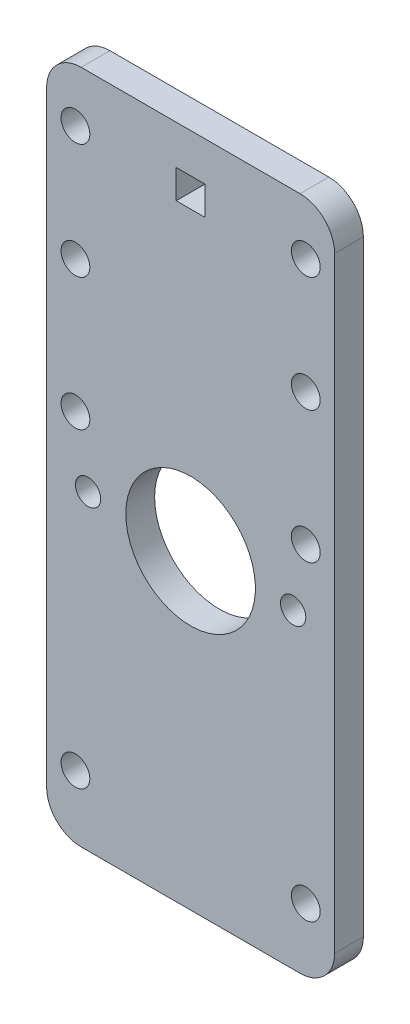
ISO-10303-21;
HEADER;
FILE_DESCRIPTION(('STEP AP214'),'2;1');
FILE_NAME('part.step','',(''),(''),'','','');
FILE_SCHEMA(('AUTOMOTIVE_DESIGN { 1 0 10303 214 1 1 1 1 }'));
ENDSEC;
DATA;
#1=APPLICATION_CONTEXT('core data for automotive mechanical design processes');
#2=APPLICATION_PROTOCOL_DEFINITION('international standard','automotive_design',2000,#1);
#3=PRODUCT_CONTEXT('',#1,'mechanical');
#4=PRODUCT('Part','Part','',(#3));
#5=PRODUCT_RELATED_PRODUCT_CATEGORY('part','',(#4));
#6=PRODUCT_DEFINITION_FORMATION('','',#4);
#7=PRODUCT_DEFINITION_CONTEXT('part definition',#1,'design');
#8=PRODUCT_DEFINITION('design','',#6,#7);
#9=PRODUCT_DEFINITION_SHAPE('','',#8);
#10=(LENGTH_UNIT() NAMED_UNIT(*) SI_UNIT(.MILLI.,.METRE.));
#11=(NAMED_UNIT(*) PLANE_ANGLE_UNIT() SI_UNIT($,.RADIAN.));
#12=(NAMED_UNIT(*) SI_UNIT($,.STERADIAN.) SOLID_ANGLE_UNIT());
#13=UNCERTAINTY_MEASURE_WITH_UNIT(LENGTH_MEASURE(1.E-05),#10,'distance_accuracy_value','');
#14=(GEOMETRIC_REPRESENTATION_CONTEXT(3) GLOBAL_UNCERTAINTY_ASSIGNED_CONTEXT((#13)) GLOBAL_UNIT_ASSIGNED_CONTEXT((#10,
#11,#12)) REPRESENTATION_CONTEXT('',''));
#15=CARTESIAN_POINT('',(0.,0.,0.));
#16=DIRECTION('',(0.,0.,1.));
#17=DIRECTION('',(1.,0.,0.));
#18=AXIS2_PLACEMENT_3D('',#15,#16,#17);
#19=CARTESIAN_POINT('',(-18.1,-22.0973062704397,-6.35));
#20=DIRECTION('',(0.,0.,-1.));
#21=DIRECTION('',(-1.,0.,0.));
#22=AXIS2_PLACEMENT_3D('',#19,#20,#21);
#23=PLANE('',#22);
#24=CARTESIAN_POINT('',(22.61,17.8847845003735,-6.35));
#25=DIRECTION('',(0.,0.,1.));
#26=DIRECTION('',(1.,0.,0.));
#27=AXIS2_PLACEMENT_3D('',#24,#25,#26);
#28=CIRCLE('',#27,2.794);
#29=CARTESIAN_POINT('',(25.404,17.8847845003735,-6.35));
#30=VERTEX_POINT('',#29);
#31=EDGE_CURVE('E597',#30,#30,#28,.T.);
#32=ORIENTED_EDGE('',*,*,#31,.T.);
#33=EDGE_LOOP('',(#32));
#34=FACE_BOUND('',#33,.T.);
#35=CARTESIAN_POINT('',(-22.61,17.8847845003735,-6.35));
#36=DIRECTION('',(0.,0.,1.));
#37=DIRECTION('',(1.,0.,0.));
#38=AXIS2_PLACEMENT_3D('',#35,#36,#37);
#39=CIRCLE('',#38,2.794);
#40=CARTESIAN_POINT('',(-19.816,17.8847845003735,-6.35));
#41=VERTEX_POINT('',#40);
#42=EDGE_CURVE('E591',#41,#41,#39,.T.);
#43=ORIENTED_EDGE('',*,*,#42,.T.);
#44=EDGE_LOOP('',(#43));
#45=FACE_BOUND('',#44,.T.);
#46=CARTESIAN_POINT('',(0.,17.8847845003735,-6.35));
#47=DIRECTION('',(0.,0.,-1.));
#48=DIRECTION('',(-1.,0.,0.));
#49=AXIS2_PLACEMENT_3D('',#46,#47,#48);
#50=CIRCLE('',#49,14.2875);
#51=CARTESIAN_POINT('',(-14.2875,17.8847845003735,-6.35));
#52=VERTEX_POINT('',#51);
#53=EDGE_CURVE('E172',#52,#52,#50,.T.);
#54=ORIENTED_EDGE('',*,*,#53,.F.);
#55=EDGE_LOOP('',(#54));
#56=FACE_BOUND('',#55,.T.);
#57=CARTESIAN_POINT('',(25.4,31.8547845003731,-6.35));
#58=DIRECTION('',(0.,0.,-1.));
#59=DIRECTION('',(-1.,0.,0.));
#60=AXIS2_PLACEMENT_3D('',#57,#58,#59);
#61=CIRCLE('',#60,3.175);
#62=CARTESIAN_POINT('',(22.225,31.8547845003731,-6.35));
#63=VERTEX_POINT('',#62);
#64=EDGE_CURVE('E185',#63,#63,#61,.T.);
#65=ORIENTED_EDGE('',*,*,#64,.F.);
#66=EDGE_LOOP('',(#65));
#67=FACE_BOUND('',#66,.T.);
#68=CARTESIAN_POINT('',(25.3999999999993,-36.7252154996269,-6.35));
#69=DIRECTION('',(0.,0.,-1.));
#70=DIRECTION('',(-1.,0.,0.));
#71=AXIS2_PLACEMENT_3D('',#68,#69,#70);
#72=CIRCLE('',#71,3.175);
#73=CARTESIAN_POINT('',(22.2249999999993,-36.7252154996269,-6.35));
#74=VERTEX_POINT('',#73);
#75=EDGE_CURVE('E191',#74,#74,#72,.T.);
#76=ORIENTED_EDGE('',*,*,#75,.F.);
#77=EDGE_LOOP('',(#76));
#78=FACE_BOUND('',#77,.T.);
#79=CARTESIAN_POINT('',(-25.4000000000007,-36.7252154996265,-6.35));
#80=DIRECTION('',(0.,0.,-1.));
#81=DIRECTION('',(-1.,0.,0.));
#82=AXIS2_PLACEMENT_3D('',#79,#80,#81);
#83=CIRCLE('',#82,3.175);
#84=CARTESIAN_POINT('',(-28.5750000000007,-36.7252154996265,-6.35));
#85=VERTEX_POINT('',#84);
#86=EDGE_CURVE('E178',#85,#85,#83,.T.);
#87=ORIENTED_EDGE('',*,*,#86,.F.);
#88=EDGE_LOOP('',(#87));
#89=FACE_BOUND('',#88,.T.);
#90=CARTESIAN_POINT('',(-25.4,31.8547845003735,-6.35));
#91=DIRECTION('',(0.,0.,-1.));
#92=DIRECTION('',(-1.,0.,0.));
#93=AXIS2_PLACEMENT_3D('',#90,#91,#92);
#94=CIRCLE('',#93,3.175);
#95=CARTESIAN_POINT('',(-28.575,31.8547845003735,-6.35));
#96=VERTEX_POINT('',#95);
#97=EDGE_CURVE('E184',#96,#96,#94,.T.);
#98=ORIENTED_EDGE('',*,*,#97,.F.);
#99=EDGE_LOOP('',(#98));
#100=FACE_BOUND('',#99,.T.);
#101=DIRECTION('',(-1.,0.,0.));
#102=VECTOR('',#101,1.);
#103=CARTESIAN_POINT('',(31.75,-50.6952154996265,-6.35));
#104=LINE('',#103,#102);
#105=CARTESIAN_POINT('',(24.13,-50.6952154996265,-6.35));
#106=VERTEX_POINT('',#105);
#107=CARTESIAN_POINT('',(-24.13,-50.6952154996265,-6.35));
#108=VERTEX_POINT('',#107);
#109=EDGE_CURVE('E209',#106,#108,#104,.T.);
#110=ORIENTED_EDGE('',*,*,#109,.T.);
#111=CARTESIAN_POINT('',(-24.13,-43.0752154996265,-6.35));
#112=DIRECTION('',(0.,0.,-1.));
#113=DIRECTION('',(-1.,0.,0.));
#114=AXIS2_PLACEMENT_3D('',#111,#112,#113);
#115=CIRCLE('',#114,7.62);
#116=CARTESIAN_POINT('',(-31.75,-43.0752154996265,-6.35));
#117=VERTEX_POINT('',#116);
#118=EDGE_CURVE('E233',#108,#117,#115,.T.);
#119=ORIENTED_EDGE('',*,*,#118,.T.);
#120=DIRECTION('',(0.,1.,0.));
#121=VECTOR('',#120,1.);
#122=CARTESIAN_POINT('',(-31.75,38.2047845003735,-6.35));
#123=LINE('',#122,#121);
#124=CARTESIAN_POINT('',(-31.75,90.5847845003735,-6.35));
#125=VERTEX_POINT('',#124);
#126=EDGE_CURVE('E202',#117,#125,#123,.T.);
#127=ORIENTED_EDGE('',*,*,#126,.T.);
#128=CARTESIAN_POINT('',(-24.13,90.5847845003735,-6.35));
#129=DIRECTION('',(0.,0.,-1.));
#130=DIRECTION('',(-1.,0.,0.));
#131=AXIS2_PLACEMENT_3D('',#128,#129,#130);
#132=CIRCLE('',#131,7.62);
#133=CARTESIAN_POINT('',(-24.13,98.2047845003734,-6.35));
#134=VERTEX_POINT('',#133);
#135=EDGE_CURVE('E229',#125,#134,#132,.T.);
#136=ORIENTED_EDGE('',*,*,#135,.T.);
#137=DIRECTION('',(1.,0.,0.));
#138=VECTOR('',#137,1.);
#139=CARTESIAN_POINT('',(31.75,98.2047845003734,-6.35));
#140=LINE('',#139,#138);
#141=CARTESIAN_POINT('',(24.13,98.2047845003734,-6.35));
#142=VERTEX_POINT('',#141);
#143=EDGE_CURVE('E166',#134,#142,#140,.T.);
#144=ORIENTED_EDGE('',*,*,#143,.T.);
#145=CARTESIAN_POINT('',(24.13,90.5847845003735,-6.35));
#146=DIRECTION('',(0.,0.,-1.));
#147=DIRECTION('',(-1.,0.,0.));
#148=AXIS2_PLACEMENT_3D('',#145,#146,#147);
#149=CIRCLE('',#148,7.62);
#150=CARTESIAN_POINT('',(31.75,90.5847845003735,-6.35));
#151=VERTEX_POINT('',#150);
#152=EDGE_CURVE('E227',#142,#151,#149,.T.);
#153=ORIENTED_EDGE('',*,*,#152,.T.);
#154=DIRECTION('',(0.,-1.,0.));
#155=VECTOR('',#154,1.);
#156=CARTESIAN_POINT('',(31.75,38.2047845003735,-6.35));
#157=LINE('',#156,#155);
#158=CARTESIAN_POINT('',(31.75,-43.0752154996265,-6.35));
#159=VERTEX_POINT('',#158);
#160=EDGE_CURVE('E218',#151,#159,#157,.T.);
#161=ORIENTED_EDGE('',*,*,#160,.T.);
#162=CARTESIAN_POINT('',(24.13,-43.0752154996265,-6.35));
#163=DIRECTION('',(0.,0.,-1.));
#164=DIRECTION('',(-1.,0.,0.));
#165=AXIS2_PLACEMENT_3D('',#162,#163,#164);
#166=CIRCLE('',#165,7.62);
#167=EDGE_CURVE('E231',#159,#106,#166,.T.);
#168=ORIENTED_EDGE('',*,*,#167,.T.);
#169=EDGE_LOOP('',(#110,#119,#127,#136,#144,#153,#161,#168));
#170=FACE_BOUND('',#169,.T.);
#171=CARTESIAN_POINT('',(-25.4,86.3797845003735,-6.35));
#172=DIRECTION('',(0.,0.,-1.));
#173=DIRECTION('',(1.,0.,0.));
#174=AXIS2_PLACEMENT_3D('',#171,#172,#173);
#175=CIRCLE('',#174,3.175);
#176=CARTESIAN_POINT('',(-22.225,86.3797845003735,-6.35));
#177=VERTEX_POINT('',#176);
#178=EDGE_CURVE('E588',#177,#177,#175,.T.);
#179=ORIENTED_EDGE('',*,*,#178,.F.);
#180=EDGE_LOOP('',(#179));
#181=FACE_BOUND('',#180,.T.);
#182=CARTESIAN_POINT('',(25.3999999999997,60.9797845003735,-6.35));
#183=DIRECTION('',(0.,0.,-1.));
#184=DIRECTION('',(-1.,0.,0.));
#185=AXIS2_PLACEMENT_3D('',#182,#183,#184);
#186=CIRCLE('',#185,3.175);
#187=CARTESIAN_POINT('',(22.2249999999997,60.9797845003735,-6.35));
#188=VERTEX_POINT('',#187);
#189=EDGE_CURVE('E582',#188,#188,#186,.T.);
#190=ORIENTED_EDGE('',*,*,#189,.F.);
#191=EDGE_LOOP('',(#190));
#192=FACE_BOUND('',#191,.T.);
#193=CARTESIAN_POINT('',(-25.3999999999997,60.9797845003735,-6.35));
#194=DIRECTION('',(0.,0.,-1.));
#195=DIRECTION('',(1.,0.,0.));
#196=AXIS2_PLACEMENT_3D('',#193,#194,#195);
#197=CIRCLE('',#196,3.175);
#198=CARTESIAN_POINT('',(-22.2249999999997,60.9797845003735,-6.35));
#199=VERTEX_POINT('',#198);
#200=EDGE_CURVE('E574',#199,#199,#197,.T.);
#201=ORIENTED_EDGE('',*,*,#200,.F.);
#202=EDGE_LOOP('',(#201));
#203=FACE_BOUND('',#202,.T.);
#204=CARTESIAN_POINT('',(25.4,86.3797845003735,-6.35));
#205=DIRECTION('',(0.,0.,-1.));
#206=DIRECTION('',(-1.,0.,0.));
#207=AXIS2_PLACEMENT_3D('',#204,#205,#206);
#208=CIRCLE('',#207,3.175);
#209=CARTESIAN_POINT('',(22.225,86.3797845003735,-6.35));
#210=VERTEX_POINT('',#209);
#211=EDGE_CURVE('E153',#210,#210,#208,.T.);
#212=ORIENTED_EDGE('',*,*,#211,.F.);
#213=EDGE_LOOP('',(#212));
#214=FACE_BOUND('',#213,.T.);
#215=DIRECTION('',(1.,0.,0.));
#216=VECTOR('',#215,1.);
#217=CARTESIAN_POINT('',(3.175,89.5547845003735,-6.35));
#218=LINE('',#217,#216);
#219=CARTESIAN_POINT('',(-3.175,89.5547845003735,-6.35));
#220=VERTEX_POINT('',#219);
#221=CARTESIAN_POINT('',(3.175,89.5547845003735,-6.35));
#222=VERTEX_POINT('',#221);
#223=EDGE_CURVE('E159',#220,#222,#218,.T.);
#224=ORIENTED_EDGE('',*,*,#223,.F.);
#225=DIRECTION('',(0.,1.,0.));
#226=VECTOR('',#225,1.);
#227=CARTESIAN_POINT('',(-3.175,89.5547845003735,-6.35));
#228=LINE('',#227,#226);
#229=CARTESIAN_POINT('',(-3.175,83.2047845003735,-6.35));
#230=VERTEX_POINT('',#229);
#231=EDGE_CURVE('E130',#230,#220,#228,.T.);
#232=ORIENTED_EDGE('',*,*,#231,.F.);
#233=DIRECTION('',(-1.,0.,0.));
#234=VECTOR('',#233,1.);
#235=CARTESIAN_POINT('',(3.175,83.2047845003735,-6.35));
#236=LINE('',#235,#234);
#237=CARTESIAN_POINT('',(3.175,83.2047845003735,-6.35));
#238=VERTEX_POINT('',#237);
#239=EDGE_CURVE('E147',#238,#230,#236,.T.);
#240=ORIENTED_EDGE('',*,*,#239,.F.);
#241=DIRECTION('',(0.,-1.,0.));
#242=VECTOR('',#241,1.);
#243=CARTESIAN_POINT('',(3.175,89.5547845003735,-6.35));
#244=LINE('',#243,#242);
#245=EDGE_CURVE('E150',#222,#238,#244,.T.);
#246=ORIENTED_EDGE('',*,*,#245,.F.);
#247=EDGE_LOOP('',(#224,#232,#240,#246));
#248=FACE_BOUND('',#247,.T.);
#249=ADVANCED_FACE('F34',(#34,#45,#56,#67,#78,#89,#100,#170,#181,#192,#203,#214,#248),#23,.T.);
#250=CARTESIAN_POINT('',(-18.1,-22.0973062704397,0.));
#251=DIRECTION('',(0.,0.,-1.));
#252=DIRECTION('',(-1.,0.,0.));
#253=AXIS2_PLACEMENT_3D('',#250,#251,#252);
#254=PLANE('',#253);
#255=CARTESIAN_POINT('',(22.61,17.8847845003735,0.));
#256=DIRECTION('',(0.,0.,1.));
#257=DIRECTION('',(1.,0.,0.));
#258=AXIS2_PLACEMENT_3D('',#255,#256,#257);
#259=CIRCLE('',#258,2.794);
#260=CARTESIAN_POINT('',(25.404,17.8847845003735,0.));
#261=VERTEX_POINT('',#260);
#262=EDGE_CURVE('E600',#261,#261,#259,.T.);
#263=ORIENTED_EDGE('',*,*,#262,.F.);
#264=EDGE_LOOP('',(#263));
#265=FACE_BOUND('',#264,.T.);
#266=CARTESIAN_POINT('',(-22.61,17.8847845003735,0.));
#267=DIRECTION('',(0.,0.,1.));
#268=DIRECTION('',(1.,0.,0.));
#269=AXIS2_PLACEMENT_3D('',#266,#267,#268);
#270=CIRCLE('',#269,2.794);
#271=CARTESIAN_POINT('',(-19.816,17.8847845003735,0.));
#272=VERTEX_POINT('',#271);
#273=EDGE_CURVE('E594',#272,#272,#270,.T.);
#274=ORIENTED_EDGE('',*,*,#273,.F.);
#275=EDGE_LOOP('',(#274));
#276=FACE_BOUND('',#275,.T.);
#277=CARTESIAN_POINT('',(0.,17.8847845003735,0.));
#278=DIRECTION('',(0.,0.,-1.));
#279=DIRECTION('',(-1.,0.,0.));
#280=AXIS2_PLACEMENT_3D('',#277,#278,#279);
#281=CIRCLE('',#280,14.2875);
#282=CARTESIAN_POINT('',(-14.2875,17.8847845003735,0.));
#283=VERTEX_POINT('',#282);
#284=EDGE_CURVE('E175',#283,#283,#281,.T.);
#285=ORIENTED_EDGE('',*,*,#284,.T.);
#286=EDGE_LOOP('',(#285));
#287=FACE_BOUND('',#286,.T.);
#288=CARTESIAN_POINT('',(25.4,31.8547845003731,0.));
#289=DIRECTION('',(0.,0.,-1.));
#290=DIRECTION('',(-1.,0.,0.));
#291=AXIS2_PLACEMENT_3D('',#288,#289,#290);
#292=CIRCLE('',#291,3.175);
#293=CARTESIAN_POINT('',(22.225,31.8547845003731,0.));
#294=VERTEX_POINT('',#293);
#295=EDGE_CURVE('E181',#294,#294,#292,.T.);
#296=ORIENTED_EDGE('',*,*,#295,.T.);
#297=EDGE_LOOP('',(#296));
#298=FACE_BOUND('',#297,.T.);
#299=CARTESIAN_POINT('',(25.3999999999993,-36.7252154996269,0.));
#300=DIRECTION('',(0.,0.,-1.));
#301=DIRECTION('',(-1.,0.,0.));
#302=AXIS2_PLACEMENT_3D('',#299,#300,#301);
#303=CIRCLE('',#302,3.175);
#304=CARTESIAN_POINT('',(22.2249999999993,-36.7252154996269,0.));
#305=VERTEX_POINT('',#304);
#306=EDGE_CURVE('E188',#305,#305,#303,.T.);
#307=ORIENTED_EDGE('',*,*,#306,.T.);
#308=EDGE_LOOP('',(#307));
#309=FACE_BOUND('',#308,.T.);
#310=CARTESIAN_POINT('',(-25.4000000000007,-36.7252154996265,0.));
#311=DIRECTION('',(0.,0.,-1.));
#312=DIRECTION('',(-1.,0.,0.));
#313=AXIS2_PLACEMENT_3D('',#310,#311,#312);
#314=CIRCLE('',#313,3.175);
#315=CARTESIAN_POINT('',(-28.5750000000007,-36.7252154996265,0.));
#316=VERTEX_POINT('',#315);
#317=EDGE_CURVE('E194',#316,#316,#314,.T.);
#318=ORIENTED_EDGE('',*,*,#317,.T.);
#319=EDGE_LOOP('',(#318));
#320=FACE_BOUND('',#319,.T.);
#321=CARTESIAN_POINT('',(-25.4,31.8547845003735,0.));
#322=DIRECTION('',(0.,0.,-1.));
#323=DIRECTION('',(-1.,0.,0.));
#324=AXIS2_PLACEMENT_3D('',#321,#322,#323);
#325=CIRCLE('',#324,3.175);
#326=CARTESIAN_POINT('',(-28.575,31.8547845003735,0.));
#327=VERTEX_POINT('',#326);
#328=EDGE_CURVE('E199',#327,#327,#325,.T.);
#329=ORIENTED_EDGE('',*,*,#328,.T.);
#330=EDGE_LOOP('',(#329));
#331=FACE_BOUND('',#330,.T.);
#332=DIRECTION('',(0.,1.,0.));
#333=VECTOR('',#332,1.);
#334=CARTESIAN_POINT('',(-31.75,38.2047845003735,0.));
#335=LINE('',#334,#333);
#336=CARTESIAN_POINT('',(-31.75,-43.0752154996265,0.));
#337=VERTEX_POINT('',#336);
#338=CARTESIAN_POINT('',(-31.75,90.5847845003735,0.));
#339=VERTEX_POINT('',#338);
#340=EDGE_CURVE('E205',#337,#339,#335,.T.);
#341=ORIENTED_EDGE('',*,*,#340,.F.);
#342=CARTESIAN_POINT('',(-24.13,-43.0752154996265,0.));
#343=DIRECTION('',(0.,0.,-1.));
#344=DIRECTION('',(-1.,0.,0.));
#345=AXIS2_PLACEMENT_3D('',#342,#343,#344);
#346=CIRCLE('',#345,7.62);
#347=CARTESIAN_POINT('',(-24.13,-50.6952154996265,0.));
#348=VERTEX_POINT('',#347);
#349=EDGE_CURVE('E245',#337,#348,#346,.F.);
#350=ORIENTED_EDGE('',*,*,#349,.T.);
#351=DIRECTION('',(-1.,0.,0.));
#352=VECTOR('',#351,1.);
#353=CARTESIAN_POINT('',(31.75,-50.6952154996265,0.));
#354=LINE('',#353,#352);
#355=CARTESIAN_POINT('',(24.13,-50.6952154996265,0.));
#356=VERTEX_POINT('',#355);
#357=EDGE_CURVE('E212',#356,#348,#354,.T.);
#358=ORIENTED_EDGE('',*,*,#357,.F.);
#359=CARTESIAN_POINT('',(24.13,-43.0752154996265,0.));
#360=DIRECTION('',(0.,0.,-1.));
#361=DIRECTION('',(-1.,0.,0.));
#362=AXIS2_PLACEMENT_3D('',#359,#360,#361);
#363=CIRCLE('',#362,7.62);
#364=CARTESIAN_POINT('',(31.75,-43.0752154996265,0.));
#365=VERTEX_POINT('',#364);
#366=EDGE_CURVE('E243',#356,#365,#363,.F.);
#367=ORIENTED_EDGE('',*,*,#366,.T.);
#368=DIRECTION('',(0.,-1.,0.));
#369=VECTOR('',#368,1.);
#370=CARTESIAN_POINT('',(31.75,38.2047845003735,0.));
#371=LINE('',#370,#369);
#372=CARTESIAN_POINT('',(31.75,90.5847845003735,0.));
#373=VERTEX_POINT('',#372);
#374=EDGE_CURVE('E208',#373,#365,#371,.T.);
#375=ORIENTED_EDGE('',*,*,#374,.F.);
#376=CARTESIAN_POINT('',(24.13,90.5847845003735,0.));
#377=DIRECTION('',(0.,0.,-1.));
#378=DIRECTION('',(-1.,0.,0.));
#379=AXIS2_PLACEMENT_3D('',#376,#377,#378);
#380=CIRCLE('',#379,7.62);
#381=CARTESIAN_POINT('',(24.13,98.2047845003734,0.));
#382=VERTEX_POINT('',#381);
#383=EDGE_CURVE('E49',#373,#382,#380,.F.);
#384=ORIENTED_EDGE('',*,*,#383,.T.);
#385=DIRECTION('',(1.,0.,0.));
#386=VECTOR('',#385,1.);
#387=CARTESIAN_POINT('',(31.75,98.2047845003734,0.));
#388=LINE('',#387,#386);
#389=CARTESIAN_POINT('',(-24.13,98.2047845003734,0.));
#390=VERTEX_POINT('',#389);
#391=EDGE_CURVE('E170',#390,#382,#388,.T.);
#392=ORIENTED_EDGE('',*,*,#391,.F.);
#393=CARTESIAN_POINT('',(-24.13,90.5847845003735,0.));
#394=DIRECTION('',(0.,0.,-1.));
#395=DIRECTION('',(-1.,0.,0.));
#396=AXIS2_PLACEMENT_3D('',#393,#394,#395);
#397=CIRCLE('',#396,7.62);
#398=EDGE_CURVE('E241',#390,#339,#397,.F.);
#399=ORIENTED_EDGE('',*,*,#398,.T.);
#400=EDGE_LOOP('',(#341,#350,#358,#367,#375,#384,#392,#399));
#401=FACE_BOUND('',#400,.T.);
#402=CARTESIAN_POINT('',(-25.4,86.3797845003735,0.));
#403=DIRECTION('',(0.,0.,-1.));
#404=DIRECTION('',(1.,0.,0.));
#405=AXIS2_PLACEMENT_3D('',#402,#403,#404);
#406=CIRCLE('',#405,3.175);
#407=CARTESIAN_POINT('',(-22.225,86.3797845003735,0.));
#408=VERTEX_POINT('',#407);
#409=EDGE_CURVE('E585',#408,#408,#406,.T.);
#410=ORIENTED_EDGE('',*,*,#409,.T.);
#411=EDGE_LOOP('',(#410));
#412=FACE_BOUND('',#411,.T.);
#413=CARTESIAN_POINT('',(25.3999999999997,60.9797845003735,0.));
#414=DIRECTION('',(0.,0.,-1.));
#415=DIRECTION('',(-1.,0.,0.));
#416=AXIS2_PLACEMENT_3D('',#413,#414,#415);
#417=CIRCLE('',#416,3.175);
#418=CARTESIAN_POINT('',(22.2249999999997,60.9797845003735,0.));
#419=VERTEX_POINT('',#418);
#420=EDGE_CURVE('E579',#419,#419,#417,.T.);
#421=ORIENTED_EDGE('',*,*,#420,.T.);
#422=EDGE_LOOP('',(#421));
#423=FACE_BOUND('',#422,.T.);
#424=CARTESIAN_POINT('',(-25.3999999999997,60.9797845003735,0.));
#425=DIRECTION('',(0.,0.,-1.));
#426=DIRECTION('',(1.,0.,0.));
#427=AXIS2_PLACEMENT_3D('',#424,#425,#426);
#428=CIRCLE('',#427,3.175);
#429=CARTESIAN_POINT('',(-22.2249999999997,60.9797845003735,0.));
#430=VERTEX_POINT('',#429);
#431=EDGE_CURVE('E572',#430,#430,#428,.T.);
#432=ORIENTED_EDGE('',*,*,#431,.T.);
#433=EDGE_LOOP('',(#432));
#434=FACE_BOUND('',#433,.T.);
#435=CARTESIAN_POINT('',(25.4,86.3797845003735,0.));
#436=DIRECTION('',(0.,0.,-1.));
#437=DIRECTION('',(-1.,0.,0.));
#438=AXIS2_PLACEMENT_3D('',#435,#436,#437);
#439=CIRCLE('',#438,3.175);
#440=CARTESIAN_POINT('',(22.225,86.3797845003735,0.));
#441=VERTEX_POINT('',#440);
#442=EDGE_CURVE('E160',#441,#441,#439,.T.);
#443=ORIENTED_EDGE('',*,*,#442,.T.);
#444=EDGE_LOOP('',(#443));
#445=FACE_BOUND('',#444,.T.);
#446=DIRECTION('',(0.,1.,0.));
#447=VECTOR('',#446,1.);
#448=CARTESIAN_POINT('',(-3.175,89.5547845003735,0.));
#449=LINE('',#448,#447);
#450=CARTESIAN_POINT('',(-3.175,83.2047845003735,0.));
#451=VERTEX_POINT('',#450);
#452=CARTESIAN_POINT('',(-3.175,89.5547845003735,0.));
#453=VERTEX_POINT('',#452);
#454=EDGE_CURVE('E127',#451,#453,#449,.T.);
#455=ORIENTED_EDGE('',*,*,#454,.T.);
#456=DIRECTION('',(1.,0.,0.));
#457=VECTOR('',#456,1.);
#458=CARTESIAN_POINT('',(3.175,89.5547845003735,0.));
#459=LINE('',#458,#457);
#460=CARTESIAN_POINT('',(3.175,89.5547845003735,0.));
#461=VERTEX_POINT('',#460);
#462=EDGE_CURVE('E139',#453,#461,#459,.T.);
#463=ORIENTED_EDGE('',*,*,#462,.T.);
#464=DIRECTION('',(0.,-1.,0.));
#465=VECTOR('',#464,1.);
#466=CARTESIAN_POINT('',(3.175,89.5547845003735,0.));
#467=LINE('',#466,#465);
#468=CARTESIAN_POINT('',(3.175,83.2047845003735,0.));
#469=VERTEX_POINT('',#468);
#470=EDGE_CURVE('E143',#461,#469,#467,.T.);
#471=ORIENTED_EDGE('',*,*,#470,.T.);
#472=DIRECTION('',(-1.,0.,0.));
#473=VECTOR('',#472,1.);
#474=CARTESIAN_POINT('',(3.175,83.2047845003735,0.));
#475=LINE('',#474,#473);
#476=EDGE_CURVE('E135',#469,#451,#475,.T.);
#477=ORIENTED_EDGE('',*,*,#476,.T.);
#478=EDGE_LOOP('',(#455,#463,#471,#477));
#479=FACE_BOUND('',#478,.T.);
#480=ADVANCED_FACE('F145',(#265,#276,#287,#298,#309,#320,#331,#401,#412,#423,#434,#445,#479),
#254,.F.);
#481=CARTESIAN_POINT('',(-31.75,38.2047845003735,0.));
#482=DIRECTION('',(-1.,0.,0.));
#483=DIRECTION('',(0.,-1.,0.));
#484=AXIS2_PLACEMENT_3D('',#481,#482,#483);
#485=PLANE('',#484);
#486=ORIENTED_EDGE('',*,*,#126,.F.);
#487=DIRECTION('',(0.,0.,-1.));
#488=VECTOR('',#487,1.);
#489=CARTESIAN_POINT('',(-31.75,-43.0752154996265,0.));
#490=LINE('',#489,#488);
#491=EDGE_CURVE('E238',#117,#337,#490,.F.);
#492=ORIENTED_EDGE('',*,*,#491,.T.);
#493=ORIENTED_EDGE('',*,*,#340,.T.);
#494=DIRECTION('',(0.,0.,-1.));
#495=VECTOR('',#494,1.);
#496=CARTESIAN_POINT('',(-31.75,90.5847845003735,0.));
#497=LINE('',#496,#495);
#498=EDGE_CURVE('E235',#339,#125,#497,.T.);
#499=ORIENTED_EDGE('',*,*,#498,.T.);
#500=EDGE_LOOP('',(#486,#492,#493,#499));
#501=FACE_BOUND('',#500,.T.);
#502=ADVANCED_FACE('F264',(#501),#485,.T.);
#503=CARTESIAN_POINT('',(31.75,-50.6952154996265,0.));
#504=DIRECTION('',(0.,-1.,0.));
#505=DIRECTION('',(1.,0.,0.));
#506=AXIS2_PLACEMENT_3D('',#503,#504,#505);
#507=PLANE('',#506);
#508=ORIENTED_EDGE('',*,*,#357,.T.);
#509=DIRECTION('',(0.,0.,-1.));
#510=VECTOR('',#509,1.);
#511=CARTESIAN_POINT('',(-24.13,-50.6952154996265,0.));
#512=LINE('',#511,#510);
#513=EDGE_CURVE('E224',#348,#108,#512,.T.);
#514=ORIENTED_EDGE('',*,*,#513,.T.);
#515=ORIENTED_EDGE('',*,*,#109,.F.);
#516=DIRECTION('',(0.,0.,-1.));
#517=VECTOR('',#516,1.);
#518=CARTESIAN_POINT('',(24.13,-50.6952154996265,0.));
#519=LINE('',#518,#517);
#520=EDGE_CURVE('E215',#106,#356,#519,.F.);
#521=ORIENTED_EDGE('',*,*,#520,.T.);
#522=EDGE_LOOP('',(#508,#514,#515,#521));
#523=FACE_BOUND('',#522,.T.);
#524=ADVANCED_FACE('F275',(#523),#507,.T.);
#525=CARTESIAN_POINT('',(31.75,38.2047845003735,0.));
#526=DIRECTION('',(1.,0.,0.));
#527=DIRECTION('',(0.,1.,0.));
#528=AXIS2_PLACEMENT_3D('',#525,#526,#527);
#529=PLANE('',#528);
#530=ORIENTED_EDGE('',*,*,#374,.T.);
#531=DIRECTION('',(0.,0.,-1.));
#532=VECTOR('',#531,1.);
#533=CARTESIAN_POINT('',(31.75,-43.0752154996265,0.));
#534=LINE('',#533,#532);
#535=EDGE_CURVE('E249',#365,#159,#534,.T.);
#536=ORIENTED_EDGE('',*,*,#535,.T.);
#537=ORIENTED_EDGE('',*,*,#160,.F.);
#538=DIRECTION('',(0.,0.,-1.));
#539=VECTOR('',#538,1.);
#540=CARTESIAN_POINT('',(31.75,90.5847845003735,0.));
#541=LINE('',#540,#539);
#542=EDGE_CURVE('E247',#151,#373,#541,.F.);
#543=ORIENTED_EDGE('',*,*,#542,.T.);
#544=EDGE_LOOP('',(#530,#536,#537,#543));
#545=FACE_BOUND('',#544,.T.);
#546=ADVANCED_FACE('F282',(#545),#529,.T.);
#547=CARTESIAN_POINT('',(-25.4,31.8547845003735,0.));
#548=DIRECTION('',(0.,0.,-1.));
#549=DIRECTION('',(-1.,0.,0.));
#550=AXIS2_PLACEMENT_3D('',#547,#548,#549);
#551=CYLINDRICAL_SURFACE('',#550,3.175);
#552=ORIENTED_EDGE('',*,*,#328,.F.);
#553=EDGE_LOOP('',(#552));
#554=FACE_BOUND('',#553,.T.);
#555=ORIENTED_EDGE('',*,*,#97,.T.);
#556=EDGE_LOOP('',(#555));
#557=FACE_BOUND('',#556,.T.);
#558=ADVANCED_FACE('F403',(#554,#557),#551,.F.);
#559=CARTESIAN_POINT('',(-25.4000000000007,-36.7252154996265,0.));
#560=DIRECTION('',(0.,0.,-1.));
#561=DIRECTION('',(-1.,0.,0.));
#562=AXIS2_PLACEMENT_3D('',#559,#560,#561);
#563=CYLINDRICAL_SURFACE('',#562,3.175);
#564=ORIENTED_EDGE('',*,*,#317,.F.);
#565=EDGE_LOOP('',(#564));
#566=FACE_BOUND('',#565,.T.);
#567=ORIENTED_EDGE('',*,*,#86,.T.);
#568=EDGE_LOOP('',(#567));
#569=FACE_BOUND('',#568,.T.);
#570=ADVANCED_FACE('F399',(#566,#569),#563,.F.);
#571=CARTESIAN_POINT('',(25.3999999999993,-36.7252154996269,0.));
#572=DIRECTION('',(0.,0.,-1.));
#573=DIRECTION('',(-1.,0.,0.));
#574=AXIS2_PLACEMENT_3D('',#571,#572,#573);
#575=CYLINDRICAL_SURFACE('',#574,3.175);
#576=ORIENTED_EDGE('',*,*,#306,.F.);
#577=EDGE_LOOP('',(#576));
#578=FACE_BOUND('',#577,.T.);
#579=ORIENTED_EDGE('',*,*,#75,.T.);
#580=EDGE_LOOP('',(#579));
#581=FACE_BOUND('',#580,.T.);
#582=ADVANCED_FACE('F395',(#578,#581),#575,.F.);
#583=CARTESIAN_POINT('',(25.4,31.8547845003731,0.));
#584=DIRECTION('',(0.,0.,-1.));
#585=DIRECTION('',(-1.,0.,0.));
#586=AXIS2_PLACEMENT_3D('',#583,#584,#585);
#587=CYLINDRICAL_SURFACE('',#586,3.175);
#588=ORIENTED_EDGE('',*,*,#295,.F.);
#589=EDGE_LOOP('',(#588));
#590=FACE_BOUND('',#589,.T.);
#591=ORIENTED_EDGE('',*,*,#64,.T.);
#592=EDGE_LOOP('',(#591));
#593=FACE_BOUND('',#592,.T.);
#594=ADVANCED_FACE('F391',(#590,#593),#587,.F.);
#595=CARTESIAN_POINT('',(0.,17.8847845003735,0.));
#596=DIRECTION('',(0.,0.,-1.));
#597=DIRECTION('',(-1.,0.,0.));
#598=AXIS2_PLACEMENT_3D('',#595,#596,#597);
#599=CYLINDRICAL_SURFACE('',#598,14.2875);
#600=ORIENTED_EDGE('',*,*,#284,.F.);
#601=EDGE_LOOP('',(#600));
#602=FACE_BOUND('',#601,.T.);
#603=ORIENTED_EDGE('',*,*,#53,.T.);
#604=EDGE_LOOP('',(#603));
#605=FACE_BOUND('',#604,.T.);
#606=ADVANCED_FACE('F388',(#602,#605),#599,.F.);
#607=CARTESIAN_POINT('',(31.75,98.2047845003734,0.));
#608=DIRECTION('',(0.,1.,0.));
#609=DIRECTION('',(0.,0.,1.));
#610=AXIS2_PLACEMENT_3D('',#607,#608,#609);
#611=PLANE('',#610);
#612=ORIENTED_EDGE('',*,*,#143,.F.);
#613=DIRECTION('',(0.,0.,-1.));
#614=VECTOR('',#613,1.);
#615=CARTESIAN_POINT('',(-24.13,98.2047845003734,0.));
#616=LINE('',#615,#614);
#617=EDGE_CURVE('E11',#134,#390,#616,.F.);
#618=ORIENTED_EDGE('',*,*,#617,.T.);
#619=ORIENTED_EDGE('',*,*,#391,.T.);
#620=DIRECTION('',(0.,0.,-1.));
#621=VECTOR('',#620,1.);
#622=CARTESIAN_POINT('',(24.13,98.2047845003734,0.));
#623=LINE('',#622,#621);
#624=EDGE_CURVE('E42',#382,#142,#623,.T.);
#625=ORIENTED_EDGE('',*,*,#624,.T.);
#626=EDGE_LOOP('',(#612,#618,#619,#625));
#627=FACE_BOUND('',#626,.T.);
#628=ADVANCED_FACE('F253',(#627),#611,.T.);
#629=CARTESIAN_POINT('',(-3.175,89.5547845003735,0.));
#630=DIRECTION('',(-1.,0.,0.));
#631=DIRECTION('',(0.,-1.,0.));
#632=AXIS2_PLACEMENT_3D('',#629,#630,#631);
#633=PLANE('',#632);
#634=ORIENTED_EDGE('',*,*,#231,.T.);
#635=DIRECTION('',(0.,0.,-1.));
#636=VECTOR('',#635,1.);
#637=CARTESIAN_POINT('',(-3.175,89.5547845003735,0.));
#638=LINE('',#637,#636);
#639=EDGE_CURVE('E123',#453,#220,#638,.T.);
#640=ORIENTED_EDGE('',*,*,#639,.F.);
#641=ORIENTED_EDGE('',*,*,#454,.F.);
#642=DIRECTION('',(0.,0.,-1.));
#643=VECTOR('',#642,1.);
#644=CARTESIAN_POINT('',(-3.175,83.2047845003735,0.));
#645=LINE('',#644,#643);
#646=EDGE_CURVE('E164',#451,#230,#645,.T.);
#647=ORIENTED_EDGE('',*,*,#646,.T.);
#648=EDGE_LOOP('',(#634,#640,#641,#647));
#649=FACE_BOUND('',#648,.T.);
#650=ADVANCED_FACE('F125',(#649),#633,.F.);
#651=CARTESIAN_POINT('',(3.175,83.2047845003735,0.));
#652=DIRECTION('',(0.,-1.,0.));
#653=DIRECTION('',(0.,0.,-1.));
#654=AXIS2_PLACEMENT_3D('',#651,#652,#653);
#655=PLANE('',#654);
#656=ORIENTED_EDGE('',*,*,#239,.T.);
#657=ORIENTED_EDGE('',*,*,#646,.F.);
#658=ORIENTED_EDGE('',*,*,#476,.F.);
#659=DIRECTION('',(0.,0.,-1.));
#660=VECTOR('',#659,1.);
#661=CARTESIAN_POINT('',(3.175,83.2047845003735,0.));
#662=LINE('',#661,#660);
#663=EDGE_CURVE('E167',#469,#238,#662,.T.);
#664=ORIENTED_EDGE('',*,*,#663,.T.);
#665=EDGE_LOOP('',(#656,#657,#658,#664));
#666=FACE_BOUND('',#665,.T.);
#667=ADVANCED_FACE('F374',(#666),#655,.F.);
#668=CARTESIAN_POINT('',(3.175,89.5547845003735,0.));
#669=DIRECTION('',(1.,0.,0.));
#670=DIRECTION('',(0.,1.,0.));
#671=AXIS2_PLACEMENT_3D('',#668,#669,#670);
#672=PLANE('',#671);
#673=ORIENTED_EDGE('',*,*,#245,.T.);
#674=ORIENTED_EDGE('',*,*,#663,.F.);
#675=ORIENTED_EDGE('',*,*,#470,.F.);
#676=DIRECTION('',(0.,0.,-1.));
#677=VECTOR('',#676,1.);
#678=CARTESIAN_POINT('',(3.175,89.5547845003735,0.));
#679=LINE('',#678,#677);
#680=EDGE_CURVE('E134',#461,#222,#679,.T.);
#681=ORIENTED_EDGE('',*,*,#680,.T.);
#682=EDGE_LOOP('',(#673,#674,#675,#681));
#683=FACE_BOUND('',#682,.T.);
#684=ADVANCED_FACE('F377',(#683),#672,.F.);
#685=CARTESIAN_POINT('',(3.175,89.5547845003735,0.));
#686=DIRECTION('',(0.,1.,0.));
#687=DIRECTION('',(0.,0.,1.));
#688=AXIS2_PLACEMENT_3D('',#685,#686,#687);
#689=PLANE('',#688);
#690=ORIENTED_EDGE('',*,*,#223,.T.);
#691=ORIENTED_EDGE('',*,*,#680,.F.);
#692=ORIENTED_EDGE('',*,*,#462,.F.);
#693=ORIENTED_EDGE('',*,*,#639,.T.);
#694=EDGE_LOOP('',(#690,#691,#692,#693));
#695=FACE_BOUND('',#694,.T.);
#696=ADVANCED_FACE('F140',(#695),#689,.F.);
#697=CARTESIAN_POINT('',(25.4,86.3797845003735,0.));
#698=DIRECTION('',(0.,0.,-1.));
#699=DIRECTION('',(-1.,0.,0.));
#700=AXIS2_PLACEMENT_3D('',#697,#698,#699);
#701=CYLINDRICAL_SURFACE('',#700,3.175);
#702=ORIENTED_EDGE('',*,*,#442,.F.);
#703=EDGE_LOOP('',(#702));
#704=FACE_BOUND('',#703,.T.);
#705=ORIENTED_EDGE('',*,*,#211,.T.);
#706=EDGE_LOOP('',(#705));
#707=FACE_BOUND('',#706,.T.);
#708=ADVANCED_FACE('F369',(#704,#707),#701,.F.);
#709=CARTESIAN_POINT('',(-25.3999999999997,60.9797845003735,0.));
#710=DIRECTION('',(0.,0.,-1.));
#711=DIRECTION('',(-1.,0.,0.));
#712=AXIS2_PLACEMENT_3D('',#709,#710,#711);
#713=CYLINDRICAL_SURFACE('',#712,3.175);
#714=ORIENTED_EDGE('',*,*,#431,.F.);
#715=EDGE_LOOP('',(#714));
#716=FACE_BOUND('',#715,.T.);
#717=ORIENTED_EDGE('',*,*,#200,.T.);
#718=EDGE_LOOP('',(#717));
#719=FACE_BOUND('',#718,.T.);
#720=ADVANCED_FACE('F365',(#716,#719),#713,.F.);
#721=CARTESIAN_POINT('',(25.3999999999997,60.9797845003735,0.));
#722=DIRECTION('',(0.,0.,-1.));
#723=DIRECTION('',(-1.,0.,0.));
#724=AXIS2_PLACEMENT_3D('',#721,#722,#723);
#725=CYLINDRICAL_SURFACE('',#724,3.175);
#726=ORIENTED_EDGE('',*,*,#420,.F.);
#727=EDGE_LOOP('',(#726));
#728=FACE_BOUND('',#727,.T.);
#729=ORIENTED_EDGE('',*,*,#189,.T.);
#730=EDGE_LOOP('',(#729));
#731=FACE_BOUND('',#730,.T.);
#732=ADVANCED_FACE('F361',(#728,#731),#725,.F.);
#733=CARTESIAN_POINT('',(-25.4,86.3797845003735,0.));
#734=DIRECTION('',(0.,0.,-1.));
#735=DIRECTION('',(-1.,0.,0.));
#736=AXIS2_PLACEMENT_3D('',#733,#734,#735);
#737=CYLINDRICAL_SURFACE('',#736,3.175);
#738=ORIENTED_EDGE('',*,*,#409,.F.);
#739=EDGE_LOOP('',(#738));
#740=FACE_BOUND('',#739,.T.);
#741=ORIENTED_EDGE('',*,*,#178,.T.);
#742=EDGE_LOOP('',(#741));
#743=FACE_BOUND('',#742,.T.);
#744=ADVANCED_FACE('F308',(#740,#743),#737,.F.);
#745=CARTESIAN_POINT('',(-24.13,-43.0752154996265,0.));
#746=DIRECTION('',(0.,0.,-1.));
#747=DIRECTION('',(-1.,0.,0.));
#748=AXIS2_PLACEMENT_3D('',#745,#746,#747);
#749=CYLINDRICAL_SURFACE('',#748,7.62);
#750=ORIENTED_EDGE('',*,*,#349,.F.);
#751=ORIENTED_EDGE('',*,*,#491,.F.);
#752=ORIENTED_EDGE('',*,*,#118,.F.);
#753=ORIENTED_EDGE('',*,*,#513,.F.);
#754=EDGE_LOOP('',(#750,#751,#752,#753));
#755=FACE_BOUND('',#754,.T.);
#756=ADVANCED_FACE('F272',(#755),#749,.T.);
#757=CARTESIAN_POINT('',(24.13,-43.0752154996265,0.));
#758=DIRECTION('',(0.,0.,-1.));
#759=DIRECTION('',(-1.,0.,0.));
#760=AXIS2_PLACEMENT_3D('',#757,#758,#759);
#761=CYLINDRICAL_SURFACE('',#760,7.62);
#762=ORIENTED_EDGE('',*,*,#366,.F.);
#763=ORIENTED_EDGE('',*,*,#520,.F.);
#764=ORIENTED_EDGE('',*,*,#167,.F.);
#765=ORIENTED_EDGE('',*,*,#535,.F.);
#766=EDGE_LOOP('',(#762,#763,#764,#765));
#767=FACE_BOUND('',#766,.T.);
#768=ADVANCED_FACE('F280',(#767),#761,.T.);
#769=CARTESIAN_POINT('',(-24.13,90.5847845003735,0.));
#770=DIRECTION('',(0.,0.,-1.));
#771=DIRECTION('',(-1.,0.,0.));
#772=AXIS2_PLACEMENT_3D('',#769,#770,#771);
#773=CYLINDRICAL_SURFACE('',#772,7.62);
#774=ORIENTED_EDGE('',*,*,#398,.F.);
#775=ORIENTED_EDGE('',*,*,#617,.F.);
#776=ORIENTED_EDGE('',*,*,#135,.F.);
#777=ORIENTED_EDGE('',*,*,#498,.F.);
#778=EDGE_LOOP('',(#774,#775,#776,#777));
#779=FACE_BOUND('',#778,.T.);
#780=ADVANCED_FACE('F262',(#779),#773,.T.);
#781=CARTESIAN_POINT('',(24.13,90.5847845003735,0.));
#782=DIRECTION('',(0.,0.,-1.));
#783=DIRECTION('',(-1.,0.,0.));
#784=AXIS2_PLACEMENT_3D('',#781,#782,#783);
#785=CYLINDRICAL_SURFACE('',#784,7.62);
#786=ORIENTED_EDGE('',*,*,#383,.F.);
#787=ORIENTED_EDGE('',*,*,#542,.F.);
#788=ORIENTED_EDGE('',*,*,#152,.F.);
#789=ORIENTED_EDGE('',*,*,#624,.F.);
#790=EDGE_LOOP('',(#786,#787,#788,#789));
#791=FACE_BOUND('',#790,.T.);
#792=ADVANCED_FACE('F36',(#791),#785,.T.);
#793=CARTESIAN_POINT('',(-22.61,17.8847845003735,-6.35));
#794=DIRECTION('',(0.,0.,1.));
#795=DIRECTION('',(1.,0.,0.));
#796=AXIS2_PLACEMENT_3D('',#793,#794,#795);
#797=CYLINDRICAL_SURFACE('',#796,2.794);
#798=ORIENTED_EDGE('',*,*,#42,.F.);
#799=EDGE_LOOP('',(#798));
#800=FACE_BOUND('',#799,.T.);
#801=ORIENTED_EDGE('',*,*,#273,.T.);
#802=EDGE_LOOP('',(#801));
#803=FACE_BOUND('',#802,.T.);
#804=ADVANCED_FACE('F285',(#800,#803),#797,.F.);
#805=CARTESIAN_POINT('',(22.61,17.8847845003735,-6.35));
#806=DIRECTION('',(0.,0.,1.));
#807=DIRECTION('',(1.,0.,0.));
#808=AXIS2_PLACEMENT_3D('',#805,#806,#807);
#809=CYLINDRICAL_SURFACE('',#808,2.794);
#810=ORIENTED_EDGE('',*,*,#31,.F.);
#811=EDGE_LOOP('',(#810));
#812=FACE_BOUND('',#811,.T.);
#813=ORIENTED_EDGE('',*,*,#262,.T.);
#814=EDGE_LOOP('',(#813));
#815=FACE_BOUND('',#814,.T.);
#816=ADVANCED_FACE('F290',(#812,#815),#809,.F.);
#817=CLOSED_SHELL('',(#249,#480,#502,#524,#546,#558,#570,#582,#594,#606,#628,#650,#667,#684,
#696,#708,#720,#732,#744,#756,#768,#780,#792,#804,#816));
#818=MANIFOLD_SOLID_BREP('B2',#817);
#819=ADVANCED_BREP_SHAPE_REPRESENTATION('',(#18,#818),#14);
#820=SHAPE_DEFINITION_REPRESENTATION(#9,#819);
ENDSEC;
END-ISO-10303-21;
